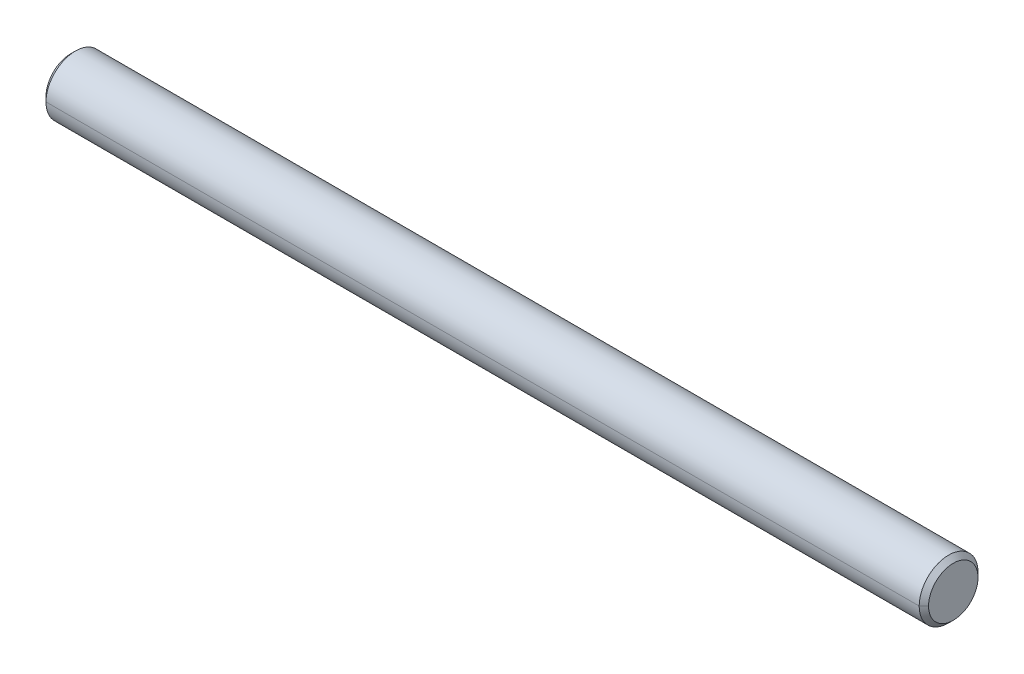
ISO-10303-21;
HEADER;
FILE_DESCRIPTION(('STEP AP214'),'2;1');
FILE_NAME('part.step','',(''),(''),'','','');
FILE_SCHEMA(('AUTOMOTIVE_DESIGN { 1 0 10303 214 1 1 1 1 }'));
ENDSEC;
DATA;
#1=APPLICATION_CONTEXT('core data for automotive mechanical design processes');
#2=APPLICATION_PROTOCOL_DEFINITION('international standard','automotive_design',2000,#1);
#3=PRODUCT_CONTEXT('',#1,'mechanical');
#4=PRODUCT('Part','Part','',(#3));
#5=PRODUCT_RELATED_PRODUCT_CATEGORY('part','',(#4));
#6=PRODUCT_DEFINITION_FORMATION('','',#4);
#7=PRODUCT_DEFINITION_CONTEXT('part definition',#1,'design');
#8=PRODUCT_DEFINITION('design','',#6,#7);
#9=PRODUCT_DEFINITION_SHAPE('','',#8);
#10=(LENGTH_UNIT() NAMED_UNIT(*) SI_UNIT(.MILLI.,.METRE.));
#11=(NAMED_UNIT(*) PLANE_ANGLE_UNIT() SI_UNIT($,.RADIAN.));
#12=(NAMED_UNIT(*) SI_UNIT($,.STERADIAN.) SOLID_ANGLE_UNIT());
#13=UNCERTAINTY_MEASURE_WITH_UNIT(LENGTH_MEASURE(1.E-05),#10,'distance_accuracy_value','');
#14=(GEOMETRIC_REPRESENTATION_CONTEXT(3) GLOBAL_UNCERTAINTY_ASSIGNED_CONTEXT((#13)) GLOBAL_UNIT_ASSIGNED_CONTEXT((#10,
#11,#12)) REPRESENTATION_CONTEXT('',''));
#15=CARTESIAN_POINT('',(0.,0.,0.));
#16=DIRECTION('',(0.,0.,1.));
#17=DIRECTION('',(1.,0.,0.));
#18=AXIS2_PLACEMENT_3D('',#15,#16,#17);
#19=CARTESIAN_POINT('',(23.8125,0.,0.));
#20=DIRECTION('',(-1.,0.,0.));
#21=DIRECTION('',(0.,0.,1.));
#22=AXIS2_PLACEMENT_3D('',#19,#20,#21);
#23=CONICAL_SURFACE('',#22,1.3335,0.785398163397438);
#24=CARTESIAN_POINT('',(23.8125,0.,0.));
#25=DIRECTION('',(1.,0.,0.));
#26=DIRECTION('',(0.,0.,-1.));
#27=AXIS2_PLACEMENT_3D('',#24,#25,#26);
#28=CIRCLE('',#27,1.3335);
#29=CARTESIAN_POINT('',(23.8125,0.,-1.3335));
#30=VERTEX_POINT('',#29);
#31=CARTESIAN_POINT('',(23.8125,0.,1.3335));
#32=VERTEX_POINT('',#31);
#33=EDGE_CURVE('E40',#30,#32,#28,.T.);
#34=ORIENTED_EDGE('',*,*,#33,.F.);
#35=DIRECTION('',(-0.707106781186556,0.,-0.70710678118654));
#36=VECTOR('',#35,1.);
#37=CARTESIAN_POINT('',(23.8125,0.,-1.3335));
#38=LINE('',#37,#36);
#39=CARTESIAN_POINT('',(23.5585,0.,-1.5875));
#40=VERTEX_POINT('',#39);
#41=EDGE_CURVE('E10',#30,#40,#38,.T.);
#42=ORIENTED_EDGE('',*,*,#41,.T.);
#43=CARTESIAN_POINT('',(23.5585,0.,0.));
#44=DIRECTION('',(-1.,0.,0.));
#45=DIRECTION('',(0.,0.,-1.));
#46=AXIS2_PLACEMENT_3D('',#43,#44,#45);
#47=CIRCLE('',#46,1.5875);
#48=CARTESIAN_POINT('',(23.5585,0.,1.5875));
#49=VERTEX_POINT('',#48);
#50=EDGE_CURVE('E98',#49,#40,#47,.T.);
#51=ORIENTED_EDGE('',*,*,#50,.F.);
#52=DIRECTION('',(-0.707106781186556,0.,0.70710678118654));
#53=VECTOR('',#52,1.);
#54=CARTESIAN_POINT('',(23.8125,0.,1.3335));
#55=LINE('',#54,#53);
#56=EDGE_CURVE('E77',#32,#49,#55,.T.);
#57=ORIENTED_EDGE('',*,*,#56,.F.);
#58=EDGE_LOOP('',(#34,#42,#51,#57));
#59=FACE_BOUND('',#58,.T.);
#60=ADVANCED_FACE('F15',(#59),#23,.T.);
#61=CARTESIAN_POINT('',(-23.5585,0.,0.));
#62=DIRECTION('',(1.,0.,0.));
#63=DIRECTION('',(0.,0.,-1.));
#64=AXIS2_PLACEMENT_3D('',#61,#62,#63);
#65=CONICAL_SURFACE('',#64,1.5875,0.78539816339745);
#66=CARTESIAN_POINT('',(-23.8125,0.,0.));
#67=DIRECTION('',(-1.,0.,0.));
#68=DIRECTION('',(0.,0.,-1.));
#69=AXIS2_PLACEMENT_3D('',#66,#67,#68);
#70=CIRCLE('',#69,1.33350000000001);
#71=CARTESIAN_POINT('',(-23.8125,0.,1.33350000000001));
#72=VERTEX_POINT('',#71);
#73=CARTESIAN_POINT('',(-23.8125,0.,-1.33350000000001));
#74=VERTEX_POINT('',#73);
#75=EDGE_CURVE('E19',#72,#74,#70,.T.);
#76=ORIENTED_EDGE('',*,*,#75,.F.);
#77=DIRECTION('',(0.707106781186546,0.,0.707106781186549));
#78=VECTOR('',#77,1.);
#79=CARTESIAN_POINT('',(-23.5585,0.,1.5875));
#80=LINE('',#79,#78);
#81=CARTESIAN_POINT('',(-23.5585,0.,1.5875));
#82=VERTEX_POINT('',#81);
#83=EDGE_CURVE('E26',#72,#82,#80,.T.);
#84=ORIENTED_EDGE('',*,*,#83,.T.);
#85=CARTESIAN_POINT('',(-23.5585,0.,0.));
#86=DIRECTION('',(1.,0.,0.));
#87=DIRECTION('',(0.,0.,-1.));
#88=AXIS2_PLACEMENT_3D('',#85,#86,#87);
#89=CIRCLE('',#88,1.5875);
#90=CARTESIAN_POINT('',(-23.5585,0.,-1.5875));
#91=VERTEX_POINT('',#90);
#92=EDGE_CURVE('E99',#91,#82,#89,.T.);
#93=ORIENTED_EDGE('',*,*,#92,.F.);
#94=DIRECTION('',(0.707106781186546,0.,-0.707106781186549));
#95=VECTOR('',#94,1.);
#96=CARTESIAN_POINT('',(-23.5585,0.,-1.5875));
#97=LINE('',#96,#95);
#98=EDGE_CURVE('E56',#74,#91,#97,.T.);
#99=ORIENTED_EDGE('',*,*,#98,.F.);
#100=EDGE_LOOP('',(#76,#84,#93,#99));
#101=FACE_BOUND('',#100,.T.);
#102=ADVANCED_FACE('F223',(#101),#65,.T.);
#103=CARTESIAN_POINT('',(23.8125,0.,0.));
#104=DIRECTION('',(-1.,0.,0.));
#105=DIRECTION('',(0.,0.,1.));
#106=AXIS2_PLACEMENT_3D('',#103,#104,#105);
#107=CYLINDRICAL_SURFACE('',#106,1.5875);
#108=ORIENTED_EDGE('',*,*,#50,.T.);
#109=DIRECTION('',(-1.,0.,0.));
#110=VECTOR('',#109,1.);
#111=CARTESIAN_POINT('',(23.8125,0.,-1.5875));
#112=LINE('',#111,#110);
#113=EDGE_CURVE('E107',#40,#91,#112,.T.);
#114=ORIENTED_EDGE('',*,*,#113,.T.);
#115=ORIENTED_EDGE('',*,*,#92,.T.);
#116=DIRECTION('',(-1.,0.,0.));
#117=VECTOR('',#116,1.);
#118=CARTESIAN_POINT('',(23.8125,0.,1.5875));
#119=LINE('',#118,#117);
#120=EDGE_CURVE('E95',#49,#82,#119,.T.);
#121=ORIENTED_EDGE('',*,*,#120,.F.);
#122=EDGE_LOOP('',(#108,#114,#115,#121));
#123=FACE_BOUND('',#122,.T.);
#124=ADVANCED_FACE('F96',(#123),#107,.T.);
#125=CARTESIAN_POINT('',(23.8125,0.,0.));
#126=DIRECTION('',(-1.,0.,0.));
#127=DIRECTION('',(0.,0.,1.));
#128=AXIS2_PLACEMENT_3D('',#125,#126,#127);
#129=CYLINDRICAL_SURFACE('',#128,1.5875);
#130=ORIENTED_EDGE('',*,*,#113,.F.);
#131=CARTESIAN_POINT('',(23.5585,0.,0.));
#132=DIRECTION('',(-1.,0.,0.));
#133=DIRECTION('',(0.,0.,-1.));
#134=AXIS2_PLACEMENT_3D('',#131,#132,#133);
#135=CIRCLE('',#134,1.5875);
#136=EDGE_CURVE('E87',#40,#49,#135,.T.);
#137=ORIENTED_EDGE('',*,*,#136,.T.);
#138=ORIENTED_EDGE('',*,*,#120,.T.);
#139=CARTESIAN_POINT('',(-23.5585,0.,0.));
#140=DIRECTION('',(1.,0.,0.));
#141=DIRECTION('',(0.,0.,-1.));
#142=AXIS2_PLACEMENT_3D('',#139,#140,#141);
#143=CIRCLE('',#142,1.5875);
#144=EDGE_CURVE('E104',#82,#91,#143,.T.);
#145=ORIENTED_EDGE('',*,*,#144,.T.);
#146=EDGE_LOOP('',(#130,#137,#138,#145));
#147=FACE_BOUND('',#146,.T.);
#148=ADVANCED_FACE('F109',(#147),#129,.T.);
#149=CARTESIAN_POINT('',(23.8125,0.,0.));
#150=DIRECTION('',(1.,0.,0.));
#151=DIRECTION('',(0.,1.,0.));
#152=AXIS2_PLACEMENT_3D('',#149,#150,#151);
#153=PLANE('',#152);
#154=CARTESIAN_POINT('',(23.8125,0.,0.));
#155=DIRECTION('',(1.,0.,0.));
#156=DIRECTION('',(0.,0.,-1.));
#157=AXIS2_PLACEMENT_3D('',#154,#155,#156);
#158=CIRCLE('',#157,1.3335);
#159=EDGE_CURVE('E89',#32,#30,#158,.T.);
#160=ORIENTED_EDGE('',*,*,#159,.T.);
#161=ORIENTED_EDGE('',*,*,#33,.T.);
#162=EDGE_LOOP('',(#160,#161));
#163=FACE_BOUND('',#162,.T.);
#164=ADVANCED_FACE('F205',(#163),#153,.T.);
#165=CARTESIAN_POINT('',(-23.8125,0.,0.));
#166=DIRECTION('',(1.,0.,0.));
#167=DIRECTION('',(0.,1.,0.));
#168=AXIS2_PLACEMENT_3D('',#165,#166,#167);
#169=PLANE('',#168);
#170=CARTESIAN_POINT('',(-23.8125,0.,0.));
#171=DIRECTION('',(-1.,0.,0.));
#172=DIRECTION('',(0.,0.,-1.));
#173=AXIS2_PLACEMENT_3D('',#170,#171,#172);
#174=CIRCLE('',#173,1.33350000000001);
#175=EDGE_CURVE('E118',#74,#72,#174,.T.);
#176=ORIENTED_EDGE('',*,*,#175,.T.);
#177=ORIENTED_EDGE('',*,*,#75,.T.);
#178=EDGE_LOOP('',(#176,#177));
#179=FACE_BOUND('',#178,.T.);
#180=ADVANCED_FACE('F17',(#179),#169,.F.);
#181=CARTESIAN_POINT('',(-23.5585,0.,0.));
#182=DIRECTION('',(1.,0.,0.));
#183=DIRECTION('',(0.,0.,-1.));
#184=AXIS2_PLACEMENT_3D('',#181,#182,#183);
#185=CONICAL_SURFACE('',#184,1.5875,0.78539816339745);
#186=ORIENTED_EDGE('',*,*,#83,.F.);
#187=ORIENTED_EDGE('',*,*,#175,.F.);
#188=ORIENTED_EDGE('',*,*,#98,.T.);
#189=ORIENTED_EDGE('',*,*,#144,.F.);
#190=EDGE_LOOP('',(#186,#187,#188,#189));
#191=FACE_BOUND('',#190,.T.);
#192=ADVANCED_FACE('F140',(#191),#185,.T.);
#193=CARTESIAN_POINT('',(23.8125,0.,0.));
#194=DIRECTION('',(-1.,0.,0.));
#195=DIRECTION('',(0.,0.,1.));
#196=AXIS2_PLACEMENT_3D('',#193,#194,#195);
#197=CONICAL_SURFACE('',#196,1.3335,0.785398163397438);
#198=ORIENTED_EDGE('',*,*,#41,.F.);
#199=ORIENTED_EDGE('',*,*,#159,.F.);
#200=ORIENTED_EDGE('',*,*,#56,.T.);
#201=ORIENTED_EDGE('',*,*,#136,.F.);
#202=EDGE_LOOP('',(#198,#199,#200,#201));
#203=FACE_BOUND('',#202,.T.);
#204=ADVANCED_FACE('F85',(#203),#197,.T.);
#205=CLOSED_SHELL('',(#60,#102,#124,#148,#164,#180,#192,#204));
#206=MANIFOLD_SOLID_BREP('B1',#205);
#207=ADVANCED_BREP_SHAPE_REPRESENTATION('',(#18,#206),#14);
#208=SHAPE_DEFINITION_REPRESENTATION(#9,#207);
ENDSEC;
END-ISO-10303-21;
